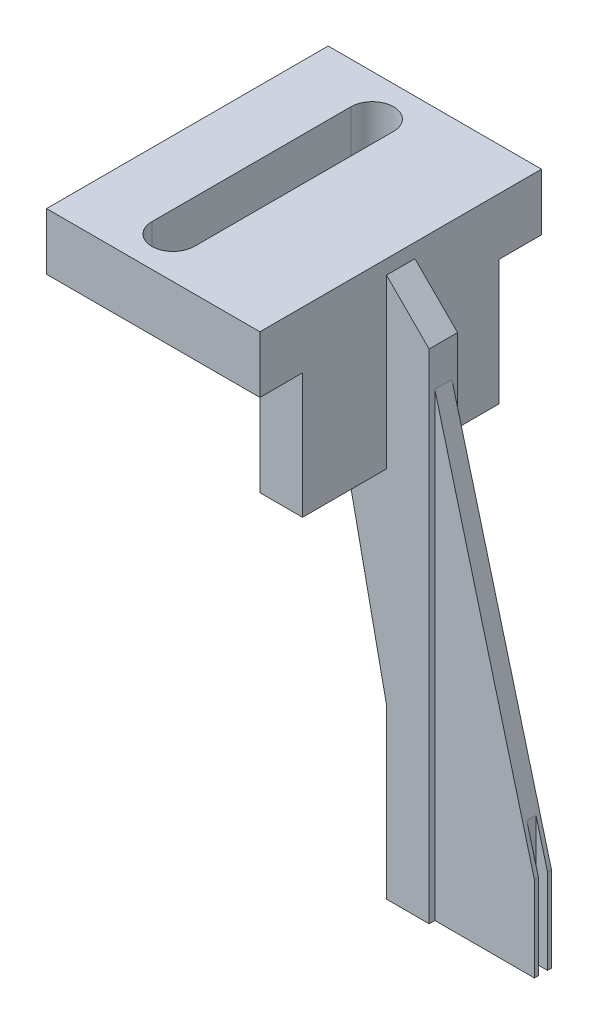
ISO-10303-21;
HEADER;
FILE_DESCRIPTION(('STEP AP214'),'2;1');
FILE_NAME('part.step','',(''),(''),'','','');
FILE_SCHEMA(('AUTOMOTIVE_DESIGN { 1 0 10303 214 1 1 1 1 }'));
ENDSEC;
DATA;
#1=APPLICATION_CONTEXT('core data for automotive mechanical design processes');
#2=APPLICATION_PROTOCOL_DEFINITION('international standard','automotive_design',2000,#1);
#3=PRODUCT_CONTEXT('',#1,'mechanical');
#4=PRODUCT('Part','Part','',(#3));
#5=PRODUCT_RELATED_PRODUCT_CATEGORY('part','',(#4));
#6=PRODUCT_DEFINITION_FORMATION('','',#4);
#7=PRODUCT_DEFINITION_CONTEXT('part definition',#1,'design');
#8=PRODUCT_DEFINITION('design','',#6,#7);
#9=PRODUCT_DEFINITION_SHAPE('','',#8);
#10=(LENGTH_UNIT() NAMED_UNIT(*) SI_UNIT(.MILLI.,.METRE.));
#11=(NAMED_UNIT(*) PLANE_ANGLE_UNIT() SI_UNIT($,.RADIAN.));
#12=(NAMED_UNIT(*) SI_UNIT($,.STERADIAN.) SOLID_ANGLE_UNIT());
#13=UNCERTAINTY_MEASURE_WITH_UNIT(LENGTH_MEASURE(1.E-05),#10,'distance_accuracy_value','');
#14=(GEOMETRIC_REPRESENTATION_CONTEXT(3) GLOBAL_UNCERTAINTY_ASSIGNED_CONTEXT((#13)) GLOBAL_UNIT_ASSIGNED_CONTEXT((#10,
#11,#12)) REPRESENTATION_CONTEXT('',''));
#15=CARTESIAN_POINT('',(0.,0.,0.));
#16=DIRECTION('',(0.,0.,1.));
#17=DIRECTION('',(1.,0.,0.));
#18=AXIS2_PLACEMENT_3D('',#15,#16,#17);
#19=CARTESIAN_POINT('',(6.,-30.6,-0.999999999999996));
#20=DIRECTION('',(0.,1.,0.));
#21=DIRECTION('',(0.,0.,1.));
#22=AXIS2_PLACEMENT_3D('',#19,#20,#21);
#23=PLANE('',#22);
#24=DIRECTION('',(0.,0.,-1.));
#25=VECTOR('',#24,1.);
#26=CARTESIAN_POINT('',(3.,-30.6,-0.999999999999996));
#27=LINE('',#26,#25);
#28=CARTESIAN_POINT('',(3.,-30.6,0.999999999999996));
#29=VERTEX_POINT('',#28);
#30=CARTESIAN_POINT('',(3.,-30.6,0.320000000000001));
#31=VERTEX_POINT('',#30);
#32=EDGE_CURVE('E274',#29,#31,#27,.T.);
#33=ORIENTED_EDGE('',*,*,#32,.T.);
#34=DIRECTION('',(1.,0.,0.));
#35=VECTOR('',#34,1.);
#36=CARTESIAN_POINT('',(6.,-30.6,0.320000000000002));
#37=LINE('',#36,#35);
#38=CARTESIAN_POINT('',(13.,-30.6,0.320000000000001));
#39=VERTEX_POINT('',#38);
#40=EDGE_CURVE('E255',#31,#39,#37,.T.);
#41=ORIENTED_EDGE('',*,*,#40,.T.);
#42=DIRECTION('',(0.,0.,-1.));
#43=VECTOR('',#42,1.);
#44=CARTESIAN_POINT('',(13.,-30.6,0.600000000000001));
#45=LINE('',#44,#43);
#46=CARTESIAN_POINT('',(13.,-30.6,0.600000000000001));
#47=VERTEX_POINT('',#46);
#48=EDGE_CURVE('E437',#47,#39,#45,.T.);
#49=ORIENTED_EDGE('',*,*,#48,.F.);
#50=DIRECTION('',(-1.,0.,0.));
#51=VECTOR('',#50,1.);
#52=CARTESIAN_POINT('',(13.,-30.6,0.600000000000001));
#53=LINE('',#52,#51);
#54=CARTESIAN_POINT('',(6.,-30.6,0.6));
#55=VERTEX_POINT('',#54);
#56=EDGE_CURVE('E402',#47,#55,#53,.T.);
#57=ORIENTED_EDGE('',*,*,#56,.T.);
#58=DIRECTION('',(0.,0.,-1.));
#59=VECTOR('',#58,1.);
#60=CARTESIAN_POINT('',(6.,-30.6,-0.999999999999996));
#61=LINE('',#60,#59);
#62=CARTESIAN_POINT('',(6.,-30.6,0.999999999999996));
#63=VERTEX_POINT('',#62);
#64=EDGE_CURVE('E290',#63,#55,#61,.T.);
#65=ORIENTED_EDGE('',*,*,#64,.F.);
#66=DIRECTION('',(-1.,0.,0.));
#67=VECTOR('',#66,1.);
#68=CARTESIAN_POINT('',(6.,-30.6,0.999999999999996));
#69=LINE('',#68,#67);
#70=EDGE_CURVE('E289',#63,#29,#69,.T.);
#71=ORIENTED_EDGE('',*,*,#70,.T.);
#72=EDGE_LOOP('',(#33,#41,#49,#57,#65,#71));
#73=FACE_BOUND('',#72,.T.);
#74=ADVANCED_FACE('F45',(#73),#23,.F.);
#75=CARTESIAN_POINT('',(13.,0.,0.));
#76=DIRECTION('',(-1.,0.,0.));
#77=DIRECTION('',(0.,0.,1.));
#78=AXIS2_PLACEMENT_3D('',#75,#76,#77);
#79=PLANE('',#78);
#80=DIRECTION('',(0.,0.,1.));
#81=VECTOR('',#80,1.);
#82=CARTESIAN_POINT('',(13.,-24.6,0.599999999999999));
#83=LINE('',#82,#81);
#84=CARTESIAN_POINT('',(13.,-24.6,-0.600000000000001));
#85=VERTEX_POINT('',#84);
#86=CARTESIAN_POINT('',(13.,-24.5999999999998,-0.320000000000001));
#87=VERTEX_POINT('',#86);
#88=EDGE_CURVE('E417',#85,#87,#83,.T.);
#89=ORIENTED_EDGE('',*,*,#88,.T.);
#90=DIRECTION('',(0.,-1.,0.));
#91=VECTOR('',#90,1.);
#92=CARTESIAN_POINT('',(13.,8.4,-0.320000000000001));
#93=LINE('',#92,#91);
#94=CARTESIAN_POINT('',(13.,-30.6,-0.320000000000001));
#95=VERTEX_POINT('',#94);
#96=EDGE_CURVE('E548',#87,#95,#93,.T.);
#97=ORIENTED_EDGE('',*,*,#96,.T.);
#98=CARTESIAN_POINT('',(13.,-30.6,-0.600000000000001));
#99=VERTEX_POINT('',#98);
#100=EDGE_CURVE('E252',#95,#99,#45,.T.);
#101=ORIENTED_EDGE('',*,*,#100,.T.);
#102=DIRECTION('',(0.,1.,0.));
#103=VECTOR('',#102,1.);
#104=CARTESIAN_POINT('',(13.,-30.6,-0.600000000000001));
#105=LINE('',#104,#103);
#106=EDGE_CURVE('E433',#99,#85,#105,.T.);
#107=ORIENTED_EDGE('',*,*,#106,.T.);
#108=EDGE_LOOP('',(#89,#97,#101,#107));
#109=FACE_BOUND('',#108,.T.);
#110=ADVANCED_FACE('F584',(#109),#79,.F.);
#111=CARTESIAN_POINT('',(3.,-4.4,6.9));
#112=DIRECTION('',(0.,0.,-1.));
#113=DIRECTION('',(-1.,0.,0.));
#114=AXIS2_PLACEMENT_3D('',#111,#112,#113);
#115=PLANE('',#114);
#116=DIRECTION('',(1.,0.,0.));
#117=VECTOR('',#116,1.);
#118=CARTESIAN_POINT('',(-12.,4.4,6.9));
#119=LINE('',#118,#117);
#120=CARTESIAN_POINT('',(0.,4.4,6.9));
#121=VERTEX_POINT('',#120);
#122=CARTESIAN_POINT('',(3.,4.4,6.9));
#123=VERTEX_POINT('',#122);
#124=EDGE_CURVE('E350',#121,#123,#119,.T.);
#125=ORIENTED_EDGE('',*,*,#124,.F.);
#126=DIRECTION('',(0.,-1.,0.));
#127=VECTOR('',#126,1.);
#128=CARTESIAN_POINT('',(0.,-4.4,6.9));
#129=LINE('',#128,#127);
#130=CARTESIAN_POINT('',(0.,-4.4,6.9));
#131=VERTEX_POINT('',#130);
#132=EDGE_CURVE('E316',#121,#131,#129,.T.);
#133=ORIENTED_EDGE('',*,*,#132,.T.);
#134=DIRECTION('',(-1.,0.,0.));
#135=VECTOR('',#134,1.);
#136=CARTESIAN_POINT('',(3.,-4.4,6.9));
#137=LINE('',#136,#135);
#138=CARTESIAN_POINT('',(3.,-4.4,6.9));
#139=VERTEX_POINT('',#138);
#140=EDGE_CURVE('E327',#139,#131,#137,.T.);
#141=ORIENTED_EDGE('',*,*,#140,.F.);
#142=DIRECTION('',(0.,-1.,0.));
#143=VECTOR('',#142,1.);
#144=CARTESIAN_POINT('',(3.,-4.4,6.9));
#145=LINE('',#144,#143);
#146=EDGE_CURVE('E299',#123,#139,#145,.T.);
#147=ORIENTED_EDGE('',*,*,#146,.F.);
#148=EDGE_LOOP('',(#125,#133,#141,#147));
#149=FACE_BOUND('',#148,.T.);
#150=ADVANCED_FACE('F616',(#149),#115,.F.);
#151=CARTESIAN_POINT('',(3.,-4.4,-6.9));
#152=DIRECTION('',(0.,0.,1.));
#153=DIRECTION('',(1.,0.,0.));
#154=AXIS2_PLACEMENT_3D('',#151,#152,#153);
#155=PLANE('',#154);
#156=DIRECTION('',(-1.,0.,0.));
#157=VECTOR('',#156,1.);
#158=CARTESIAN_POINT('',(-12.,4.4,-6.9));
#159=LINE('',#158,#157);
#160=CARTESIAN_POINT('',(3.,4.4,-6.9));
#161=VERTEX_POINT('',#160);
#162=CARTESIAN_POINT('',(0.,4.4,-6.9));
#163=VERTEX_POINT('',#162);
#164=EDGE_CURVE('E478',#161,#163,#159,.T.);
#165=ORIENTED_EDGE('',*,*,#164,.F.);
#166=DIRECTION('',(0.,1.,0.));
#167=VECTOR('',#166,1.);
#168=CARTESIAN_POINT('',(3.,-4.4,-6.9));
#169=LINE('',#168,#167);
#170=CARTESIAN_POINT('',(3.,-4.4,-6.9));
#171=VERTEX_POINT('',#170);
#172=EDGE_CURVE('E295',#171,#161,#169,.T.);
#173=ORIENTED_EDGE('',*,*,#172,.F.);
#174=DIRECTION('',(-1.,0.,0.));
#175=VECTOR('',#174,1.);
#176=CARTESIAN_POINT('',(3.,-4.4,-6.9));
#177=LINE('',#176,#175);
#178=CARTESIAN_POINT('',(0.,-4.4,-6.9));
#179=VERTEX_POINT('',#178);
#180=EDGE_CURVE('E308',#171,#179,#177,.T.);
#181=ORIENTED_EDGE('',*,*,#180,.T.);
#182=DIRECTION('',(0.,1.,0.));
#183=VECTOR('',#182,1.);
#184=CARTESIAN_POINT('',(0.,-4.4,-6.9));
#185=LINE('',#184,#183);
#186=EDGE_CURVE('E294',#179,#163,#185,.T.);
#187=ORIENTED_EDGE('',*,*,#186,.T.);
#188=EDGE_LOOP('',(#165,#173,#181,#187));
#189=FACE_BOUND('',#188,.T.);
#190=ADVANCED_FACE('F648',(#189),#155,.F.);
#191=CARTESIAN_POINT('',(6.,0.,0.));
#192=DIRECTION('',(-1.,0.,0.));
#193=DIRECTION('',(0.,0.,1.));
#194=AXIS2_PLACEMENT_3D('',#191,#192,#193);
#195=PLANE('',#194);
#196=DIRECTION('',(0.,0.,-1.));
#197=VECTOR('',#196,1.);
#198=CARTESIAN_POINT('',(6.,1.74252104122274,27.8567132062408));
#199=LINE('',#198,#197);
#200=CARTESIAN_POINT('',(6.,1.74252104122274,0.599999999999987));
#201=VERTEX_POINT('',#200);
#202=CARTESIAN_POINT('',(6.,1.74252104122274,-0.600000000000001));
#203=VERTEX_POINT('',#202);
#204=EDGE_CURVE('E465',#201,#203,#199,.T.);
#205=ORIENTED_EDGE('',*,*,#204,.T.);
#206=DIRECTION('',(0.,1.,0.));
#207=VECTOR('',#206,1.);
#208=CARTESIAN_POINT('',(6.,-30.6,-0.600000000000001));
#209=LINE('',#208,#207);
#210=CARTESIAN_POINT('',(6.,-30.6,-0.600000000000001));
#211=VERTEX_POINT('',#210);
#212=EDGE_CURVE('E425',#211,#203,#209,.T.);
#213=ORIENTED_EDGE('',*,*,#212,.F.);
#214=CARTESIAN_POINT('',(6.,-30.6,-0.999999999999996));
#215=VERTEX_POINT('',#214);
#216=EDGE_CURVE('E387',#211,#215,#61,.T.);
#217=ORIENTED_EDGE('',*,*,#216,.T.);
#218=DIRECTION('',(0.,1.,0.));
#219=VECTOR('',#218,1.);
#220=CARTESIAN_POINT('',(6.,4.4,-1.));
#221=LINE('',#220,#219);
#222=CARTESIAN_POINT('',(6.,4.4,-1.));
#223=VERTEX_POINT('',#222);
#224=EDGE_CURVE('E280',#215,#223,#221,.T.);
#225=ORIENTED_EDGE('',*,*,#224,.T.);
#226=DIRECTION('',(0.,0.,1.));
#227=VECTOR('',#226,1.);
#228=CARTESIAN_POINT('',(6.,4.4,-1.));
#229=LINE('',#228,#227);
#230=CARTESIAN_POINT('',(6.,4.4,1.));
#231=VERTEX_POINT('',#230);
#232=EDGE_CURVE('E392',#223,#231,#229,.T.);
#233=ORIENTED_EDGE('',*,*,#232,.T.);
#234=DIRECTION('',(0.,-1.,0.));
#235=VECTOR('',#234,1.);
#236=CARTESIAN_POINT('',(6.,4.4,1.));
#237=LINE('',#236,#235);
#238=EDGE_CURVE('E390',#231,#63,#237,.T.);
#239=ORIENTED_EDGE('',*,*,#238,.T.);
#240=ORIENTED_EDGE('',*,*,#64,.T.);
#241=DIRECTION('',(0.,-1.,0.));
#242=VECTOR('',#241,1.);
#243=CARTESIAN_POINT('',(6.,-30.6,0.600000000000001));
#244=LINE('',#243,#242);
#245=EDGE_CURVE('E429',#201,#55,#244,.T.);
#246=ORIENTED_EDGE('',*,*,#245,.F.);
#247=EDGE_LOOP('',(#205,#213,#217,#225,#233,#239,#240,#246));
#248=FACE_BOUND('',#247,.T.);
#249=ADVANCED_FACE('F588',(#248),#195,.F.);
#250=CARTESIAN_POINT('',(3.,-4.4,6.9));
#251=DIRECTION('',(0.,1.,0.));
#252=DIRECTION('',(0.,0.,1.));
#253=AXIS2_PLACEMENT_3D('',#250,#251,#252);
#254=PLANE('',#253);
#255=DIRECTION('',(0.,0.,-1.));
#256=VECTOR('',#255,1.);
#257=CARTESIAN_POINT('',(3.,-4.4,6.9));
#258=LINE('',#257,#256);
#259=CARTESIAN_POINT('',(3.,-4.4,-0.999999999999994));
#260=VERTEX_POINT('',#259);
#261=EDGE_CURVE('E303',#260,#171,#258,.T.);
#262=ORIENTED_EDGE('',*,*,#261,.F.);
#263=DIRECTION('',(-1.,0.,0.));
#264=VECTOR('',#263,1.);
#265=CARTESIAN_POINT('',(6.,-4.4,-0.999999999999999));
#266=LINE('',#265,#264);
#267=CARTESIAN_POINT('',(0.,-4.4,-0.999999999999999));
#268=VERTEX_POINT('',#267);
#269=EDGE_CURVE('E335',#260,#268,#266,.T.);
#270=ORIENTED_EDGE('',*,*,#269,.T.);
#271=DIRECTION('',(0.,0.,-1.));
#272=VECTOR('',#271,1.);
#273=CARTESIAN_POINT('',(0.,-4.4,6.9));
#274=LINE('',#273,#272);
#275=EDGE_CURVE('E319',#268,#179,#274,.T.);
#276=ORIENTED_EDGE('',*,*,#275,.T.);
#277=ORIENTED_EDGE('',*,*,#180,.F.);
#278=EDGE_LOOP('',(#262,#270,#276,#277));
#279=FACE_BOUND('',#278,.T.);
#280=ADVANCED_FACE('F638',(#279),#254,.F.);
#281=CARTESIAN_POINT('',(3.,0.,0.));
#282=DIRECTION('',(-1.,0.,0.));
#283=DIRECTION('',(0.,0.,1.));
#284=AXIS2_PLACEMENT_3D('',#281,#282,#283);
#285=PLANE('',#284);
#286=DIRECTION('',(0.,0.,-1.));
#287=VECTOR('',#286,1.);
#288=CARTESIAN_POINT('',(3.,7.40000000000002,-0.999999999999994));
#289=LINE('',#288,#287);
#290=CARTESIAN_POINT('',(3.,7.40000000000002,1.));
#291=VERTEX_POINT('',#290);
#292=CARTESIAN_POINT('',(3.,7.40000000000002,-1.));
#293=VERTEX_POINT('',#292);
#294=EDGE_CURVE('E339',#291,#293,#289,.T.);
#295=ORIENTED_EDGE('',*,*,#294,.T.);
#296=DIRECTION('',(0.,1.,0.));
#297=VECTOR('',#296,1.);
#298=CARTESIAN_POINT('',(3.,4.4,-1.));
#299=LINE('',#298,#297);
#300=EDGE_CURVE('E331',#260,#293,#299,.T.);
#301=ORIENTED_EDGE('',*,*,#300,.F.);
#302=ORIENTED_EDGE('',*,*,#261,.T.);
#303=ORIENTED_EDGE('',*,*,#172,.T.);
#304=DIRECTION('',(0.,0.,1.));
#305=VECTOR('',#304,1.);
#306=CARTESIAN_POINT('',(3.,4.4,-9.9));
#307=LINE('',#306,#305);
#308=CARTESIAN_POINT('',(3.,4.4,-9.9));
#309=VERTEX_POINT('',#308);
#310=EDGE_CURVE('E473',#309,#161,#307,.T.);
#311=ORIENTED_EDGE('',*,*,#310,.F.);
#312=DIRECTION('',(0.,-1.,0.));
#313=VECTOR('',#312,1.);
#314=CARTESIAN_POINT('',(3.,8.4,-9.9));
#315=LINE('',#314,#313);
#316=CARTESIAN_POINT('',(3.,8.4,-9.9));
#317=VERTEX_POINT('',#316);
#318=EDGE_CURVE('E487',#317,#309,#315,.T.);
#319=ORIENTED_EDGE('',*,*,#318,.F.);
#320=DIRECTION('',(0.,0.,-1.));
#321=VECTOR('',#320,1.);
#322=CARTESIAN_POINT('',(3.,8.4,6.9));
#323=LINE('',#322,#321);
#324=CARTESIAN_POINT('',(3.,8.4,9.9));
#325=VERTEX_POINT('',#324);
#326=EDGE_CURVE('E447',#325,#317,#323,.T.);
#327=ORIENTED_EDGE('',*,*,#326,.F.);
#328=DIRECTION('',(0.,1.,0.));
#329=VECTOR('',#328,1.);
#330=CARTESIAN_POINT('',(3.,8.4,9.9));
#331=LINE('',#330,#329);
#332=CARTESIAN_POINT('',(3.,4.4,9.9));
#333=VERTEX_POINT('',#332);
#334=EDGE_CURVE('E504',#333,#325,#331,.T.);
#335=ORIENTED_EDGE('',*,*,#334,.F.);
#336=DIRECTION('',(0.,0.,-1.));
#337=VECTOR('',#336,1.);
#338=CARTESIAN_POINT('',(3.,4.4,9.9));
#339=LINE('',#338,#337);
#340=EDGE_CURVE('E483',#333,#123,#339,.T.);
#341=ORIENTED_EDGE('',*,*,#340,.T.);
#342=ORIENTED_EDGE('',*,*,#146,.T.);
#343=CARTESIAN_POINT('',(3.,-4.4,0.999999999999999));
#344=VERTEX_POINT('',#343);
#345=EDGE_CURVE('E304',#139,#344,#258,.T.);
#346=ORIENTED_EDGE('',*,*,#345,.T.);
#347=DIRECTION('',(0.,-1.,0.));
#348=VECTOR('',#347,1.);
#349=CARTESIAN_POINT('',(3.,4.4,1.));
#350=LINE('',#349,#348);
#351=EDGE_CURVE('E275',#291,#344,#350,.T.);
#352=ORIENTED_EDGE('',*,*,#351,.F.);
#353=EDGE_LOOP('',(#295,#301,#302,#303,#311,#319,#327,#335,#341,#342,#346,#352));
#354=FACE_BOUND('',#353,.T.);
#355=ADVANCED_FACE('F634',(#354),#285,.F.);
#356=CARTESIAN_POINT('',(0.,-4.4,0.999999999999997));
#357=VERTEX_POINT('',#356);
#358=EDGE_CURVE('E300',#131,#357,#274,.T.);
#359=ORIENTED_EDGE('',*,*,#358,.T.);
#360=DIRECTION('',(1.,0.,0.));
#361=VECTOR('',#360,1.);
#362=CARTESIAN_POINT('',(6.,-4.4,0.999999999999999));
#363=LINE('',#362,#361);
#364=EDGE_CURVE('E332',#357,#344,#363,.T.);
#365=ORIENTED_EDGE('',*,*,#364,.T.);
#366=ORIENTED_EDGE('',*,*,#345,.F.);
#367=ORIENTED_EDGE('',*,*,#140,.T.);
#368=EDGE_LOOP('',(#359,#365,#366,#367));
#369=FACE_BOUND('',#368,.T.);
#370=ADVANCED_FACE('F637',(#369),#254,.F.);
#371=CARTESIAN_POINT('',(0.,0.,0.));
#372=DIRECTION('',(-1.,0.,0.));
#373=DIRECTION('',(0.,0.,1.));
#374=AXIS2_PLACEMENT_3D('',#371,#372,#373);
#375=PLANE('',#374);
#376=ORIENTED_EDGE('',*,*,#186,.F.);
#377=ORIENTED_EDGE('',*,*,#275,.F.);
#378=EDGE_CURVE('E323',#357,#268,#274,.T.);
#379=ORIENTED_EDGE('',*,*,#378,.F.);
#380=ORIENTED_EDGE('',*,*,#358,.F.);
#381=ORIENTED_EDGE('',*,*,#132,.F.);
#382=DIRECTION('',(0.,0.,1.));
#383=VECTOR('',#382,1.);
#384=CARTESIAN_POINT('',(0.,4.4,6.9));
#385=LINE('',#384,#383);
#386=EDGE_CURVE('E312',#163,#121,#385,.T.);
#387=ORIENTED_EDGE('',*,*,#386,.F.);
#388=EDGE_LOOP('',(#376,#377,#379,#380,#381,#387));
#389=FACE_BOUND('',#388,.T.);
#390=ADVANCED_FACE('F631',(#389),#375,.T.);
#391=CARTESIAN_POINT('',(6.,4.4,-1.));
#392=DIRECTION('',(0.,0.,1.));
#393=DIRECTION('',(0.,-1.,0.));
#394=AXIS2_PLACEMENT_3D('',#391,#392,#393);
#395=PLANE('',#394);
#396=ORIENTED_EDGE('',*,*,#269,.F.);
#397=ORIENTED_EDGE('',*,*,#300,.T.);
#398=DIRECTION('',(-0.707106781186543,0.707106781186552,0.));
#399=VECTOR('',#398,1.);
#400=CARTESIAN_POINT('',(5.99999999999999,4.4,-1.));
#401=LINE('',#400,#399);
#402=EDGE_CURVE('E343',#293,#223,#401,.F.);
#403=ORIENTED_EDGE('',*,*,#402,.T.);
#404=ORIENTED_EDGE('',*,*,#224,.F.);
#405=DIRECTION('',(-1.,0.,0.));
#406=VECTOR('',#405,1.);
#407=CARTESIAN_POINT('',(6.,-30.6,-0.999999999999996));
#408=LINE('',#407,#406);
#409=CARTESIAN_POINT('',(3.,-30.6,-0.999999999999996));
#410=VERTEX_POINT('',#409);
#411=EDGE_CURVE('E286',#215,#410,#408,.T.);
#412=ORIENTED_EDGE('',*,*,#411,.T.);
#413=CARTESIAN_POINT('',(3.,-18.7581535744812,-0.999999999999997));
#414=VERTEX_POINT('',#413);
#415=EDGE_CURVE('E272',#410,#414,#299,.T.);
#416=ORIENTED_EDGE('',*,*,#415,.T.);
#417=DIRECTION('',(-0.204523842999097,0.978861582474703,0.));
#418=VECTOR('',#417,1.);
#419=CARTESIAN_POINT('',(3.,-18.7581535744812,-0.999999999999997));
#420=LINE('',#419,#418);
#421=EDGE_CURVE('E458',#414,#268,#420,.T.);
#422=ORIENTED_EDGE('',*,*,#421,.T.);
#423=EDGE_LOOP('',(#396,#397,#403,#404,#412,#416,#422));
#424=FACE_BOUND('',#423,.T.);
#425=ADVANCED_FACE('F626',(#424),#395,.F.);
#426=CARTESIAN_POINT('',(6.,4.4,1.));
#427=DIRECTION('',(0.,0.,-1.));
#428=DIRECTION('',(0.,1.,0.));
#429=AXIS2_PLACEMENT_3D('',#426,#427,#428);
#430=PLANE('',#429);
#431=ORIENTED_EDGE('',*,*,#351,.T.);
#432=ORIENTED_EDGE('',*,*,#364,.F.);
#433=DIRECTION('',(0.204523842999097,-0.978861582474704,0.));
#434=VECTOR('',#433,1.);
#435=CARTESIAN_POINT('',(3.,-18.7581535744812,0.999999999999997));
#436=LINE('',#435,#434);
#437=CARTESIAN_POINT('',(3.,-18.7581535744812,0.999999999999997));
#438=VERTEX_POINT('',#437);
#439=EDGE_CURVE('E448',#357,#438,#436,.T.);
#440=ORIENTED_EDGE('',*,*,#439,.T.);
#441=EDGE_CURVE('E282',#438,#29,#350,.T.);
#442=ORIENTED_EDGE('',*,*,#441,.T.);
#443=ORIENTED_EDGE('',*,*,#70,.F.);
#444=ORIENTED_EDGE('',*,*,#238,.F.);
#445=DIRECTION('',(0.707106781186543,-0.707106781186552,0.));
#446=VECTOR('',#445,1.);
#447=CARTESIAN_POINT('',(5.99999999999999,4.4,1.));
#448=LINE('',#447,#446);
#449=EDGE_CURVE('E346',#231,#291,#448,.F.);
#450=ORIENTED_EDGE('',*,*,#449,.T.);
#451=EDGE_LOOP('',(#431,#432,#440,#442,#443,#444,#450));
#452=FACE_BOUND('',#451,.T.);
#453=ADVANCED_FACE('F621',(#452),#430,.F.);
#454=DIRECTION('',(-1.,0.,0.));
#455=VECTOR('',#454,1.);
#456=CARTESIAN_POINT('',(6.,-30.6,-0.320000000000002));
#457=LINE('',#456,#455);
#458=CARTESIAN_POINT('',(3.,-30.6,-0.320000000000001));
#459=VERTEX_POINT('',#458);
#460=EDGE_CURVE('E244',#95,#459,#457,.T.);
#461=ORIENTED_EDGE('',*,*,#460,.T.);
#462=EDGE_CURVE('E249',#459,#410,#27,.T.);
#463=ORIENTED_EDGE('',*,*,#462,.T.);
#464=ORIENTED_EDGE('',*,*,#411,.F.);
#465=ORIENTED_EDGE('',*,*,#216,.F.);
#466=DIRECTION('',(-1.,0.,0.));
#467=VECTOR('',#466,1.);
#468=CARTESIAN_POINT('',(13.,-30.6,-0.600000000000001));
#469=LINE('',#468,#467);
#470=EDGE_CURVE('E410',#99,#211,#469,.T.);
#471=ORIENTED_EDGE('',*,*,#470,.F.);
#472=ORIENTED_EDGE('',*,*,#100,.F.);
#473=EDGE_LOOP('',(#461,#463,#464,#465,#471,#472));
#474=FACE_BOUND('',#473,.T.);
#475=ADVANCED_FACE('F246',(#474),#23,.F.);
#476=CARTESIAN_POINT('',(3.,0.,0.));
#477=DIRECTION('',(-1.,0.,0.));
#478=DIRECTION('',(0.,0.,1.));
#479=AXIS2_PLACEMENT_3D('',#476,#477,#478);
#480=PLANE('',#479);
#481=DIRECTION('',(0.,1.,0.));
#482=VECTOR('',#481,1.);
#483=CARTESIAN_POINT('',(3.,0.,0.320000000000004));
#484=LINE('',#483,#482);
#485=CARTESIAN_POINT('',(3.,-30.,0.320000000000001));
#486=VERTEX_POINT('',#485);
#487=EDGE_CURVE('E264',#31,#486,#484,.T.);
#488=ORIENTED_EDGE('',*,*,#487,.F.);
#489=ORIENTED_EDGE('',*,*,#32,.F.);
#490=ORIENTED_EDGE('',*,*,#441,.F.);
#491=DIRECTION('',(0.,0.,-1.));
#492=VECTOR('',#491,1.);
#493=CARTESIAN_POINT('',(3.,-18.7581535744812,15.6682164583288));
#494=LINE('',#493,#492);
#495=EDGE_CURVE('E455',#438,#414,#494,.T.);
#496=ORIENTED_EDGE('',*,*,#495,.T.);
#497=ORIENTED_EDGE('',*,*,#415,.F.);
#498=ORIENTED_EDGE('',*,*,#462,.F.);
#499=DIRECTION('',(0.,-1.,0.));
#500=VECTOR('',#499,1.);
#501=CARTESIAN_POINT('',(3.,0.,-0.320000000000004));
#502=LINE('',#501,#500);
#503=CARTESIAN_POINT('',(3.,-30.,-0.320000000000001));
#504=VERTEX_POINT('',#503);
#505=EDGE_CURVE('E258',#504,#459,#502,.T.);
#506=ORIENTED_EDGE('',*,*,#505,.F.);
#507=DIRECTION('',(0.,0.,-1.));
#508=VECTOR('',#507,1.);
#509=CARTESIAN_POINT('',(3.,-30.,0.));
#510=LINE('',#509,#508);
#511=EDGE_CURVE('E265',#486,#504,#510,.T.);
#512=ORIENTED_EDGE('',*,*,#511,.F.);
#513=EDGE_LOOP('',(#488,#489,#490,#496,#497,#498,#506,#512));
#514=FACE_BOUND('',#513,.T.);
#515=ADVANCED_FACE('F269',(#514),#480,.T.);
#516=CARTESIAN_POINT('',(13.,-30.6,0.600000000000001));
#517=DIRECTION('',(0.,0.,-1.));
#518=DIRECTION('',(0.,1.,0.));
#519=AXIS2_PLACEMENT_3D('',#516,#517,#518);
#520=PLANE('',#519);
#521=ORIENTED_EDGE('',*,*,#245,.T.);
#522=ORIENTED_EDGE('',*,*,#56,.F.);
#523=DIRECTION('',(0.,-1.,0.));
#524=VECTOR('',#523,1.);
#525=CARTESIAN_POINT('',(13.,-30.6,0.600000000000001));
#526=LINE('',#525,#524);
#527=CARTESIAN_POINT('',(13.,-24.6,0.599999999999999));
#528=VERTEX_POINT('',#527);
#529=EDGE_CURVE('E428',#528,#47,#526,.T.);
#530=ORIENTED_EDGE('',*,*,#529,.F.);
#531=DIRECTION('',(-0.256817465372063,0.966459926473866,0.));
#532=VECTOR('',#531,1.);
#533=CARTESIAN_POINT('',(13.,-24.6,0.599999999999996));
#534=LINE('',#533,#532);
#535=EDGE_CURVE('E461',#528,#201,#534,.T.);
#536=ORIENTED_EDGE('',*,*,#535,.T.);
#537=EDGE_LOOP('',(#521,#522,#530,#536));
#538=FACE_BOUND('',#537,.T.);
#539=ADVANCED_FACE('F592',(#538),#520,.F.);
#540=CARTESIAN_POINT('',(13.,-30.6,-0.600000000000001));
#541=DIRECTION('',(0.,0.,1.));
#542=DIRECTION('',(1.,0.,0.));
#543=AXIS2_PLACEMENT_3D('',#540,#541,#542);
#544=PLANE('',#543);
#545=ORIENTED_EDGE('',*,*,#212,.T.);
#546=DIRECTION('',(0.256817465372063,-0.966459926473865,0.));
#547=VECTOR('',#546,1.);
#548=CARTESIAN_POINT('',(13.,-24.6,-0.600000000000001));
#549=LINE('',#548,#547);
#550=EDGE_CURVE('E469',#203,#85,#549,.T.);
#551=ORIENTED_EDGE('',*,*,#550,.T.);
#552=ORIENTED_EDGE('',*,*,#106,.F.);
#553=ORIENTED_EDGE('',*,*,#470,.T.);
#554=EDGE_LOOP('',(#545,#551,#552,#553));
#555=FACE_BOUND('',#554,.T.);
#556=ADVANCED_FACE('F585',(#555),#544,.F.);
#557=ORIENTED_EDGE('',*,*,#48,.T.);
#558=DIRECTION('',(0.,-1.,0.));
#559=VECTOR('',#558,1.);
#560=CARTESIAN_POINT('',(13.,8.4,0.320000000000001));
#561=LINE('',#560,#559);
#562=CARTESIAN_POINT('',(13.,-24.5999999999998,0.320000000000001));
#563=VERTEX_POINT('',#562);
#564=EDGE_CURVE('E549',#563,#39,#561,.T.);
#565=ORIENTED_EDGE('',*,*,#564,.F.);
#566=EDGE_CURVE('E422',#563,#528,#83,.T.);
#567=ORIENTED_EDGE('',*,*,#566,.T.);
#568=ORIENTED_EDGE('',*,*,#529,.T.);
#569=EDGE_LOOP('',(#557,#565,#567,#568));
#570=FACE_BOUND('',#569,.T.);
#571=ADVANCED_FACE('F598',(#570),#79,.F.);
#572=CARTESIAN_POINT('',(0.,4.4,0.));
#573=DIRECTION('',(0.,1.,0.));
#574=DIRECTION('',(0.,0.,1.));
#575=AXIS2_PLACEMENT_3D('',#572,#573,#574);
#576=PLANE('',#575);
#577=DIRECTION('',(0.,0.,-1.));
#578=VECTOR('',#577,1.);
#579=CARTESIAN_POINT('',(-4.5,4.4,0.));
#580=LINE('',#579,#578);
#581=CARTESIAN_POINT('',(-4.5,4.4,7.));
#582=VERTEX_POINT('',#581);
#583=CARTESIAN_POINT('',(-4.5,4.4,-7.));
#584=VERTEX_POINT('',#583);
#585=EDGE_CURVE('E523',#582,#584,#580,.T.);
#586=ORIENTED_EDGE('',*,*,#585,.T.);
#587=CARTESIAN_POINT('',(-6.,4.4,-7.));
#588=DIRECTION('',(0.,1.,0.));
#589=DIRECTION('',(0.,0.,1.));
#590=AXIS2_PLACEMENT_3D('',#587,#588,#589);
#591=CIRCLE('',#590,1.5);
#592=CARTESIAN_POINT('',(-7.5,4.4,-7.));
#593=VERTEX_POINT('',#592);
#594=EDGE_CURVE('E515',#584,#593,#591,.T.);
#595=ORIENTED_EDGE('',*,*,#594,.T.);
#596=DIRECTION('',(0.,0.,1.));
#597=VECTOR('',#596,1.);
#598=CARTESIAN_POINT('',(-7.5,4.4,0.));
#599=LINE('',#598,#597);
#600=CARTESIAN_POINT('',(-7.5,4.4,7.));
#601=VERTEX_POINT('',#600);
#602=EDGE_CURVE('E354',#593,#601,#599,.T.);
#603=ORIENTED_EDGE('',*,*,#602,.T.);
#604=CARTESIAN_POINT('',(-6.,4.4,7.));
#605=DIRECTION('',(0.,1.,0.));
#606=DIRECTION('',(0.,0.,1.));
#607=AXIS2_PLACEMENT_3D('',#604,#605,#606);
#608=CIRCLE('',#607,1.5);
#609=EDGE_CURVE('E519',#601,#582,#608,.T.);
#610=ORIENTED_EDGE('',*,*,#609,.T.);
#611=EDGE_LOOP('',(#586,#595,#603,#610));
#612=FACE_BOUND('',#611,.T.);
#613=DIRECTION('',(0.,0.,1.));
#614=VECTOR('',#613,1.);
#615=CARTESIAN_POINT('',(-12.,4.4,6.9));
#616=LINE('',#615,#614);
#617=CARTESIAN_POINT('',(-12.,4.4,-9.9));
#618=VERTEX_POINT('',#617);
#619=CARTESIAN_POINT('',(-12.,4.4,9.9));
#620=VERTEX_POINT('',#619);
#621=EDGE_CURVE('E444',#618,#620,#616,.T.);
#622=ORIENTED_EDGE('',*,*,#621,.F.);
#623=DIRECTION('',(-1.,0.,0.));
#624=VECTOR('',#623,1.);
#625=CARTESIAN_POINT('',(-12.,4.4,-9.9));
#626=LINE('',#625,#624);
#627=EDGE_CURVE('E477',#309,#618,#626,.T.);
#628=ORIENTED_EDGE('',*,*,#627,.F.);
#629=ORIENTED_EDGE('',*,*,#310,.T.);
#630=ORIENTED_EDGE('',*,*,#164,.T.);
#631=ORIENTED_EDGE('',*,*,#386,.T.);
#632=ORIENTED_EDGE('',*,*,#124,.T.);
#633=ORIENTED_EDGE('',*,*,#340,.F.);
#634=DIRECTION('',(1.,0.,0.));
#635=VECTOR('',#634,1.);
#636=CARTESIAN_POINT('',(-12.,4.4,9.9));
#637=LINE('',#636,#635);
#638=EDGE_CURVE('E508',#620,#333,#637,.T.);
#639=ORIENTED_EDGE('',*,*,#638,.F.);
#640=EDGE_LOOP('',(#622,#628,#629,#630,#631,#632,#633,#639));
#641=FACE_BOUND('',#640,.T.);
#642=ADVANCED_FACE('F685',(#612,#641),#576,.F.);
#643=CARTESIAN_POINT('',(-12.,8.4,6.9));
#644=DIRECTION('',(1.,0.,0.));
#645=DIRECTION('',(0.,0.,-1.));
#646=AXIS2_PLACEMENT_3D('',#643,#644,#645);
#647=PLANE('',#646);
#648=ORIENTED_EDGE('',*,*,#621,.T.);
#649=DIRECTION('',(0.,-1.,0.));
#650=VECTOR('',#649,1.);
#651=CARTESIAN_POINT('',(-12.,8.4,9.9));
#652=LINE('',#651,#650);
#653=CARTESIAN_POINT('',(-12.,8.4,9.9));
#654=VERTEX_POINT('',#653);
#655=EDGE_CURVE('E511',#654,#620,#652,.T.);
#656=ORIENTED_EDGE('',*,*,#655,.F.);
#657=DIRECTION('',(0.,0.,1.));
#658=VECTOR('',#657,1.);
#659=CARTESIAN_POINT('',(-12.,8.4,6.9));
#660=LINE('',#659,#658);
#661=CARTESIAN_POINT('',(-12.,8.4,-9.9));
#662=VERTEX_POINT('',#661);
#663=EDGE_CURVE('E431',#662,#654,#660,.T.);
#664=ORIENTED_EDGE('',*,*,#663,.F.);
#665=DIRECTION('',(0.,1.,0.));
#666=VECTOR('',#665,1.);
#667=CARTESIAN_POINT('',(-12.,8.4,-9.9));
#668=LINE('',#667,#666);
#669=EDGE_CURVE('E482',#618,#662,#668,.T.);
#670=ORIENTED_EDGE('',*,*,#669,.F.);
#671=EDGE_LOOP('',(#648,#656,#664,#670));
#672=FACE_BOUND('',#671,.T.);
#673=ADVANCED_FACE('F702',(#672),#647,.F.);
#674=CARTESIAN_POINT('',(0.,8.4,0.));
#675=DIRECTION('',(0.,1.,0.));
#676=DIRECTION('',(0.,0.,1.));
#677=AXIS2_PLACEMENT_3D('',#674,#675,#676);
#678=PLANE('',#677);
#679=CARTESIAN_POINT('',(-6.,8.4,-7.));
#680=DIRECTION('',(0.,1.,0.));
#681=DIRECTION('',(0.,0.,1.));
#682=AXIS2_PLACEMENT_3D('',#679,#680,#681);
#683=CIRCLE('',#682,1.5);
#684=CARTESIAN_POINT('',(-4.5,8.4,-7.));
#685=VERTEX_POINT('',#684);
#686=CARTESIAN_POINT('',(-7.5,8.4,-7.));
#687=VERTEX_POINT('',#686);
#688=EDGE_CURVE('E359',#685,#687,#683,.T.);
#689=ORIENTED_EDGE('',*,*,#688,.F.);
#690=DIRECTION('',(0.,0.,-1.));
#691=VECTOR('',#690,1.);
#692=CARTESIAN_POINT('',(-4.5,8.4,0.));
#693=LINE('',#692,#691);
#694=CARTESIAN_POINT('',(-4.5,8.4,7.));
#695=VERTEX_POINT('',#694);
#696=EDGE_CURVE('E526',#695,#685,#693,.T.);
#697=ORIENTED_EDGE('',*,*,#696,.F.);
#698=CARTESIAN_POINT('',(-6.,8.4,7.));
#699=DIRECTION('',(0.,1.,0.));
#700=DIRECTION('',(0.,0.,1.));
#701=AXIS2_PLACEMENT_3D('',#698,#699,#700);
#702=CIRCLE('',#701,1.5);
#703=CARTESIAN_POINT('',(-7.5,8.4,7.));
#704=VERTEX_POINT('',#703);
#705=EDGE_CURVE('E356',#704,#695,#702,.T.);
#706=ORIENTED_EDGE('',*,*,#705,.F.);
#707=DIRECTION('',(0.,0.,1.));
#708=VECTOR('',#707,1.);
#709=CARTESIAN_POINT('',(-7.5,8.4,0.));
#710=LINE('',#709,#708);
#711=EDGE_CURVE('E351',#687,#704,#710,.T.);
#712=ORIENTED_EDGE('',*,*,#711,.F.);
#713=EDGE_LOOP('',(#689,#697,#706,#712));
#714=FACE_BOUND('',#713,.T.);
#715=ORIENTED_EDGE('',*,*,#326,.T.);
#716=DIRECTION('',(1.,0.,0.));
#717=VECTOR('',#716,1.);
#718=CARTESIAN_POINT('',(-12.,8.4,-9.9));
#719=LINE('',#718,#717);
#720=EDGE_CURVE('E490',#662,#317,#719,.T.);
#721=ORIENTED_EDGE('',*,*,#720,.F.);
#722=ORIENTED_EDGE('',*,*,#663,.T.);
#723=DIRECTION('',(-1.,0.,0.));
#724=VECTOR('',#723,1.);
#725=CARTESIAN_POINT('',(-12.,8.4,9.9));
#726=LINE('',#725,#724);
#727=EDGE_CURVE('E499',#325,#654,#726,.T.);
#728=ORIENTED_EDGE('',*,*,#727,.F.);
#729=EDGE_LOOP('',(#715,#721,#722,#728));
#730=FACE_BOUND('',#729,.T.);
#731=ADVANCED_FACE('F665',(#714,#730),#678,.T.);
#732=CARTESIAN_POINT('',(3.,-18.7581535744812,15.6682164583288));
#733=DIRECTION('',(-0.978861582474703,-0.204523842999097,0.));
#734=DIRECTION('',(0.204523842999097,-0.978861582474704,0.));
#735=AXIS2_PLACEMENT_3D('',#732,#733,#734);
#736=PLANE('',#735);
#737=ORIENTED_EDGE('',*,*,#439,.F.);
#738=ORIENTED_EDGE('',*,*,#378,.T.);
#739=ORIENTED_EDGE('',*,*,#421,.F.);
#740=ORIENTED_EDGE('',*,*,#495,.F.);
#741=EDGE_LOOP('',(#737,#738,#739,#740));
#742=FACE_BOUND('',#741,.T.);
#743=ADVANCED_FACE('F657',(#742),#736,.T.);
#744=CARTESIAN_POINT('',(3.,7.40000000000002,0.));
#745=DIRECTION('',(0.707106781186552,0.707106781186543,0.));
#746=DIRECTION('',(0.,0.,1.));
#747=AXIS2_PLACEMENT_3D('',#744,#745,#746);
#748=PLANE('',#747);
#749=ORIENTED_EDGE('',*,*,#449,.F.);
#750=ORIENTED_EDGE('',*,*,#232,.F.);
#751=ORIENTED_EDGE('',*,*,#402,.F.);
#752=ORIENTED_EDGE('',*,*,#294,.F.);
#753=EDGE_LOOP('',(#749,#750,#751,#752));
#754=FACE_BOUND('',#753,.T.);
#755=ADVANCED_FACE('F653',(#754),#748,.T.);
#756=CARTESIAN_POINT('',(13.,-24.6,27.8567132062408));
#757=DIRECTION('',(0.966459926473865,0.256817465372063,0.));
#758=DIRECTION('',(-0.256817465372063,0.966459926473866,0.));
#759=AXIS2_PLACEMENT_3D('',#756,#757,#758);
#760=PLANE('',#759);
#761=DIRECTION('',(-0.256817465372063,0.966459926473866,0.));
#762=VECTOR('',#761,1.);
#763=CARTESIAN_POINT('',(13.,-24.6,-0.320000000000001));
#764=LINE('',#763,#762);
#765=CARTESIAN_POINT('',(12.1920882435766,-21.5596525081381,-0.320000000000001));
#766=VERTEX_POINT('',#765);
#767=EDGE_CURVE('E369',#87,#766,#764,.T.);
#768=ORIENTED_EDGE('',*,*,#767,.F.);
#769=ORIENTED_EDGE('',*,*,#88,.F.);
#770=ORIENTED_EDGE('',*,*,#550,.F.);
#771=ORIENTED_EDGE('',*,*,#204,.F.);
#772=ORIENTED_EDGE('',*,*,#535,.F.);
#773=ORIENTED_EDGE('',*,*,#566,.F.);
#774=DIRECTION('',(0.256817465372063,-0.966459926473866,0.));
#775=VECTOR('',#774,1.);
#776=CARTESIAN_POINT('',(13.,-24.6,0.320000000000001));
#777=LINE('',#776,#775);
#778=CARTESIAN_POINT('',(12.1920882435766,-21.5596525081381,0.320000000000001));
#779=VERTEX_POINT('',#778);
#780=EDGE_CURVE('E362',#779,#563,#777,.T.);
#781=ORIENTED_EDGE('',*,*,#780,.F.);
#782=DIRECTION('',(0.,0.,1.));
#783=VECTOR('',#782,1.);
#784=CARTESIAN_POINT('',(12.1920882435766,-21.5596525081381,27.8567132062408));
#785=LINE('',#784,#783);
#786=EDGE_CURVE('E365',#766,#779,#785,.T.);
#787=ORIENTED_EDGE('',*,*,#786,.F.);
#788=EDGE_LOOP('',(#768,#769,#770,#771,#772,#773,#781,#787));
#789=FACE_BOUND('',#788,.T.);
#790=ADVANCED_FACE('F580',(#789),#760,.T.);
#791=CARTESIAN_POINT('',(0.,0.,-9.9));
#792=DIRECTION('',(0.,0.,1.));
#793=DIRECTION('',(1.,0.,0.));
#794=AXIS2_PLACEMENT_3D('',#791,#792,#793);
#795=PLANE('',#794);
#796=ORIENTED_EDGE('',*,*,#669,.T.);
#797=ORIENTED_EDGE('',*,*,#720,.T.);
#798=ORIENTED_EDGE('',*,*,#318,.T.);
#799=ORIENTED_EDGE('',*,*,#627,.T.);
#800=EDGE_LOOP('',(#796,#797,#798,#799));
#801=FACE_BOUND('',#800,.T.);
#802=ADVANCED_FACE('F663',(#801),#795,.F.);
#803=CARTESIAN_POINT('',(0.,0.,9.9));
#804=DIRECTION('',(0.,0.,1.));
#805=DIRECTION('',(1.,0.,0.));
#806=AXIS2_PLACEMENT_3D('',#803,#804,#805);
#807=PLANE('',#806);
#808=ORIENTED_EDGE('',*,*,#655,.T.);
#809=ORIENTED_EDGE('',*,*,#638,.T.);
#810=ORIENTED_EDGE('',*,*,#334,.T.);
#811=ORIENTED_EDGE('',*,*,#727,.T.);
#812=EDGE_LOOP('',(#808,#809,#810,#811));
#813=FACE_BOUND('',#812,.T.);
#814=ADVANCED_FACE('F696',(#813),#807,.T.);
#815=CARTESIAN_POINT('',(-6.,-30.6,-7.));
#816=DIRECTION('',(0.,1.,0.));
#817=DIRECTION('',(0.,0.,1.));
#818=AXIS2_PLACEMENT_3D('',#815,#816,#817);
#819=CYLINDRICAL_SURFACE('',#818,1.5);
#820=DIRECTION('',(0.,1.,0.));
#821=VECTOR('',#820,1.);
#822=CARTESIAN_POINT('',(-4.5,-30.6,-7.));
#823=LINE('',#822,#821);
#824=EDGE_CURVE('E355',#584,#685,#823,.T.);
#825=ORIENTED_EDGE('',*,*,#824,.T.);
#826=ORIENTED_EDGE('',*,*,#688,.T.);
#827=DIRECTION('',(0.,1.,0.));
#828=VECTOR('',#827,1.);
#829=CARTESIAN_POINT('',(-7.5,-30.6,-7.));
#830=LINE('',#829,#828);
#831=EDGE_CURVE('E254',#593,#687,#830,.T.);
#832=ORIENTED_EDGE('',*,*,#831,.F.);
#833=ORIENTED_EDGE('',*,*,#594,.F.);
#834=EDGE_LOOP('',(#825,#826,#832,#833));
#835=FACE_BOUND('',#834,.T.);
#836=ADVANCED_FACE('F709',(#835),#819,.F.);
#837=CARTESIAN_POINT('',(-6.,-30.6,7.));
#838=DIRECTION('',(0.,1.,0.));
#839=DIRECTION('',(0.,0.,1.));
#840=AXIS2_PLACEMENT_3D('',#837,#838,#839);
#841=CYLINDRICAL_SURFACE('',#840,1.5);
#842=DIRECTION('',(0.,1.,0.));
#843=VECTOR('',#842,1.);
#844=CARTESIAN_POINT('',(-7.5,-30.6,7.));
#845=LINE('',#844,#843);
#846=EDGE_CURVE('E531',#601,#704,#845,.T.);
#847=ORIENTED_EDGE('',*,*,#846,.T.);
#848=ORIENTED_EDGE('',*,*,#705,.T.);
#849=DIRECTION('',(0.,1.,0.));
#850=VECTOR('',#849,1.);
#851=CARTESIAN_POINT('',(-4.5,-30.6,7.));
#852=LINE('',#851,#850);
#853=EDGE_CURVE('E535',#582,#695,#852,.T.);
#854=ORIENTED_EDGE('',*,*,#853,.F.);
#855=ORIENTED_EDGE('',*,*,#609,.F.);
#856=EDGE_LOOP('',(#847,#848,#854,#855));
#857=FACE_BOUND('',#856,.T.);
#858=ADVANCED_FACE('F911',(#857),#841,.F.);
#859=CARTESIAN_POINT('',(-4.5,-30.6,-7.));
#860=DIRECTION('',(1.,0.,0.));
#861=DIRECTION('',(0.,0.,-1.));
#862=AXIS2_PLACEMENT_3D('',#859,#860,#861);
#863=PLANE('',#862);
#864=ORIENTED_EDGE('',*,*,#853,.T.);
#865=ORIENTED_EDGE('',*,*,#696,.T.);
#866=ORIENTED_EDGE('',*,*,#824,.F.);
#867=ORIENTED_EDGE('',*,*,#585,.F.);
#868=EDGE_LOOP('',(#864,#865,#866,#867));
#869=FACE_BOUND('',#868,.T.);
#870=ADVANCED_FACE('F900',(#869),#863,.F.);
#871=CARTESIAN_POINT('',(-7.5,-30.6,-7.));
#872=DIRECTION('',(-1.,0.,0.));
#873=DIRECTION('',(0.,0.,1.));
#874=AXIS2_PLACEMENT_3D('',#871,#872,#873);
#875=PLANE('',#874);
#876=ORIENTED_EDGE('',*,*,#831,.T.);
#877=ORIENTED_EDGE('',*,*,#711,.T.);
#878=ORIENTED_EDGE('',*,*,#846,.F.);
#879=ORIENTED_EDGE('',*,*,#602,.F.);
#880=EDGE_LOOP('',(#876,#877,#878,#879));
#881=FACE_BOUND('',#880,.T.);
#882=ADVANCED_FACE('F845',(#881),#875,.F.);
#883=CARTESIAN_POINT('',(13.,8.4,-0.320000000000001));
#884=DIRECTION('',(0.,0.,-1.));
#885=DIRECTION('',(-1.,0.,0.));
#886=AXIS2_PLACEMENT_3D('',#883,#884,#885);
#887=PLANE('',#886);
#888=DIRECTION('',(0.,-1.,0.));
#889=VECTOR('',#888,1.);
#890=CARTESIAN_POINT('',(12.1920882435766,8.4,-0.320000000000001));
#891=LINE('',#890,#889);
#892=CARTESIAN_POINT('',(12.1920882435766,-29.,-0.320000000000001));
#893=VERTEX_POINT('',#892);
#894=EDGE_CURVE('E556',#766,#893,#891,.T.);
#895=ORIENTED_EDGE('',*,*,#894,.T.);
#896=DIRECTION('',(0.707106781186548,0.707106781186548,0.));
#897=VECTOR('',#896,1.);
#898=CARTESIAN_POINT('',(31.2960441217883,-9.89604412178832,-0.319999999999999));
#899=LINE('',#898,#897);
#900=CARTESIAN_POINT('',(11.1920882435766,-30.,-0.320000000000001));
#901=VERTEX_POINT('',#900);
#902=EDGE_CURVE('E55',#893,#901,#899,.F.);
#903=ORIENTED_EDGE('',*,*,#902,.T.);
#904=DIRECTION('',(1.,0.,0.));
#905=VECTOR('',#904,1.);
#906=CARTESIAN_POINT('',(-12.,-30.,-0.320000000000001));
#907=LINE('',#906,#905);
#908=EDGE_CURVE('E260',#504,#901,#907,.T.);
#909=ORIENTED_EDGE('',*,*,#908,.F.);
#910=ORIENTED_EDGE('',*,*,#505,.T.);
#911=ORIENTED_EDGE('',*,*,#460,.F.);
#912=ORIENTED_EDGE('',*,*,#96,.F.);
#913=ORIENTED_EDGE('',*,*,#767,.T.);
#914=EDGE_LOOP('',(#895,#903,#909,#910,#911,#912,#913));
#915=FACE_BOUND('',#914,.T.);
#916=ADVANCED_FACE('F259',(#915),#887,.F.);
#917=CARTESIAN_POINT('',(12.1920882435766,8.4,0.320000000000001));
#918=DIRECTION('',(-1.,0.,0.));
#919=DIRECTION('',(0.,0.,1.));
#920=AXIS2_PLACEMENT_3D('',#917,#918,#919);
#921=PLANE('',#920);
#922=DIRECTION('',(0.,-1.,0.));
#923=VECTOR('',#922,1.);
#924=CARTESIAN_POINT('',(12.1920882435766,8.4,0.320000000000001));
#925=LINE('',#924,#923);
#926=CARTESIAN_POINT('',(12.1920882435766,-29.,0.320000000000001));
#927=VERTEX_POINT('',#926);
#928=EDGE_CURVE('E552',#779,#927,#925,.T.);
#929=ORIENTED_EDGE('',*,*,#928,.T.);
#930=DIRECTION('',(0.,0.,-1.));
#931=VECTOR('',#930,1.);
#932=CARTESIAN_POINT('',(12.1920882435766,-29.,0.320000000000001));
#933=LINE('',#932,#931);
#934=EDGE_CURVE('E372',#927,#893,#933,.T.);
#935=ORIENTED_EDGE('',*,*,#934,.T.);
#936=ORIENTED_EDGE('',*,*,#894,.F.);
#937=ORIENTED_EDGE('',*,*,#786,.T.);
#938=EDGE_LOOP('',(#929,#935,#936,#937));
#939=FACE_BOUND('',#938,.T.);
#940=ADVANCED_FACE('F576',(#939),#921,.F.);
#941=CARTESIAN_POINT('',(13.,8.4,0.320000000000001));
#942=DIRECTION('',(0.,0.,1.));
#943=DIRECTION('',(1.,0.,0.));
#944=AXIS2_PLACEMENT_3D('',#941,#942,#943);
#945=PLANE('',#944);
#946=ORIENTED_EDGE('',*,*,#564,.T.);
#947=ORIENTED_EDGE('',*,*,#40,.F.);
#948=ORIENTED_EDGE('',*,*,#487,.T.);
#949=DIRECTION('',(1.,0.,0.));
#950=VECTOR('',#949,1.);
#951=CARTESIAN_POINT('',(-12.,-30.,0.320000000000001));
#952=LINE('',#951,#950);
#953=CARTESIAN_POINT('',(11.1920882435766,-30.,0.320000000000001));
#954=VERTEX_POINT('',#953);
#955=EDGE_CURVE('E565',#486,#954,#952,.T.);
#956=ORIENTED_EDGE('',*,*,#955,.T.);
#957=DIRECTION('',(-0.707106781186548,-0.707106781186548,0.));
#958=VECTOR('',#957,1.);
#959=CARTESIAN_POINT('',(31.2960441217883,-9.89604412178832,0.319999999999999));
#960=LINE('',#959,#958);
#961=EDGE_CURVE('E11',#954,#927,#960,.F.);
#962=ORIENTED_EDGE('',*,*,#961,.T.);
#963=ORIENTED_EDGE('',*,*,#928,.F.);
#964=ORIENTED_EDGE('',*,*,#780,.T.);
#965=EDGE_LOOP('',(#946,#947,#948,#956,#962,#963,#964));
#966=FACE_BOUND('',#965,.T.);
#967=ADVANCED_FACE('F571',(#966),#945,.F.);
#968=CARTESIAN_POINT('',(-12.,-30.,0.320000000000001));
#969=DIRECTION('',(0.,1.,0.));
#970=DIRECTION('',(0.,0.,1.));
#971=AXIS2_PLACEMENT_3D('',#968,#969,#970);
#972=PLANE('',#971);
#973=ORIENTED_EDGE('',*,*,#908,.T.);
#974=DIRECTION('',(0.,0.,1.));
#975=VECTOR('',#974,1.);
#976=CARTESIAN_POINT('',(11.1920882435766,-30.,0.320000000000001));
#977=LINE('',#976,#975);
#978=EDGE_CURVE('E62',#901,#954,#977,.T.);
#979=ORIENTED_EDGE('',*,*,#978,.T.);
#980=ORIENTED_EDGE('',*,*,#955,.F.);
#981=ORIENTED_EDGE('',*,*,#511,.T.);
#982=EDGE_LOOP('',(#973,#979,#980,#981));
#983=FACE_BOUND('',#982,.T.);
#984=ADVANCED_FACE('F602',(#983),#972,.F.);
#985=CARTESIAN_POINT('',(12.1920882435766,-29.,0.320000000000001));
#986=DIRECTION('',(-0.707106781186547,0.707106781186547,0.));
#987=DIRECTION('',(0.,0.,-1.));
#988=AXIS2_PLACEMENT_3D('',#985,#986,#987);
#989=PLANE('',#988);
#990=ORIENTED_EDGE('',*,*,#961,.F.);
#991=ORIENTED_EDGE('',*,*,#978,.F.);
#992=ORIENTED_EDGE('',*,*,#902,.F.);
#993=ORIENTED_EDGE('',*,*,#934,.F.);
#994=EDGE_LOOP('',(#990,#991,#992,#993));
#995=FACE_BOUND('',#994,.T.);
#996=ADVANCED_FACE('F48',(#995),#989,.F.);
#997=CLOSED_SHELL('',(#74,#110,#150,#190,#249,#280,#355,#370,#390,#425,#453,#475,#515,#539,#556,
#571,#642,#673,#731,#743,#755,#790,#802,#814,#836,#858,#870,#882,#916,#940,#967,#984,#996));
#998=MANIFOLD_SOLID_BREP('B2',#997);
#999=ADVANCED_BREP_SHAPE_REPRESENTATION('',(#18,#998),#14);
#1000=SHAPE_DEFINITION_REPRESENTATION(#9,#999);
ENDSEC;
END-ISO-10303-21;
